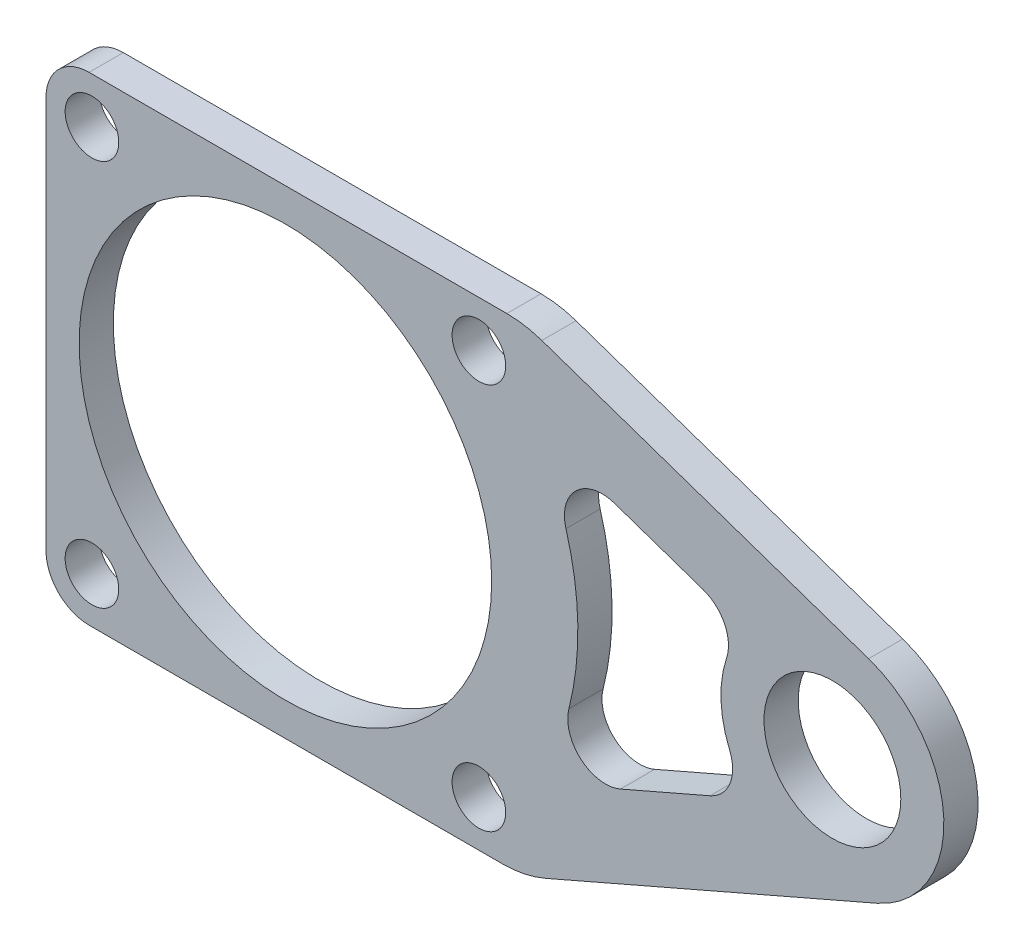
ISO-10303-21;
HEADER;
FILE_DESCRIPTION(('STEP AP214'),'2;1');
FILE_NAME('part.step','',(''),(''),'','','');
FILE_SCHEMA(('AUTOMOTIVE_DESIGN { 1 0 10303 214 1 1 1 1 }'));
ENDSEC;
DATA;
#1=APPLICATION_CONTEXT('core data for automotive mechanical design processes');
#2=APPLICATION_PROTOCOL_DEFINITION('international standard','automotive_design',2000,#1);
#3=PRODUCT_CONTEXT('',#1,'mechanical');
#4=PRODUCT('Part','Part','',(#3));
#5=PRODUCT_RELATED_PRODUCT_CATEGORY('part','',(#4));
#6=PRODUCT_DEFINITION_FORMATION('','',#4);
#7=PRODUCT_DEFINITION_CONTEXT('part definition',#1,'design');
#8=PRODUCT_DEFINITION('design','',#6,#7);
#9=PRODUCT_DEFINITION_SHAPE('','',#8);
#10=(LENGTH_UNIT() NAMED_UNIT(*) SI_UNIT(.MILLI.,.METRE.));
#11=(NAMED_UNIT(*) PLANE_ANGLE_UNIT() SI_UNIT($,.RADIAN.));
#12=(NAMED_UNIT(*) SI_UNIT($,.STERADIAN.) SOLID_ANGLE_UNIT());
#13=UNCERTAINTY_MEASURE_WITH_UNIT(LENGTH_MEASURE(1.E-05),#10,'distance_accuracy_value','');
#14=(GEOMETRIC_REPRESENTATION_CONTEXT(3) GLOBAL_UNCERTAINTY_ASSIGNED_CONTEXT((#13)) GLOBAL_UNIT_ASSIGNED_CONTEXT((#10,
#11,#12)) REPRESENTATION_CONTEXT('',''));
#15=CARTESIAN_POINT('',(0.,0.,0.));
#16=DIRECTION('',(0.,0.,1.));
#17=DIRECTION('',(1.,0.,0.));
#18=AXIS2_PLACEMENT_3D('',#15,#16,#17);
#19=CARTESIAN_POINT('',(50.7785111216399,1.477433,3.175));
#20=DIRECTION('',(0.,0.,1.));
#21=DIRECTION('',(1.,0.,0.));
#22=AXIS2_PLACEMENT_3D('',#19,#20,#21);
#23=PLANE('',#22);
#24=CARTESIAN_POINT('',(-17.9605122421383,17.9605122421383,3.175));
#25=DIRECTION('',(0.,0.,1.));
#26=DIRECTION('',(1.,0.,0.));
#27=AXIS2_PLACEMENT_3D('',#24,#25,#26);
#28=CIRCLE('',#27,2.4892);
#29=CARTESIAN_POINT('',(-15.4713122421383,17.9605122421383,3.175));
#30=VERTEX_POINT('',#29);
#31=EDGE_CURVE('E289',#30,#30,#28,.T.);
#32=ORIENTED_EDGE('',*,*,#31,.F.);
#33=EDGE_LOOP('',(#32));
#34=FACE_BOUND('',#33,.T.);
#35=CARTESIAN_POINT('',(17.9605122421383,17.9605122421383,3.175));
#36=DIRECTION('',(0.,0.,1.));
#37=DIRECTION('',(1.,0.,0.));
#38=AXIS2_PLACEMENT_3D('',#35,#36,#37);
#39=CIRCLE('',#38,2.4892);
#40=CARTESIAN_POINT('',(20.4497122421383,17.9605122421383,3.175));
#41=VERTEX_POINT('',#40);
#42=EDGE_CURVE('E304',#41,#41,#39,.T.);
#43=ORIENTED_EDGE('',*,*,#42,.F.);
#44=EDGE_LOOP('',(#43));
#45=FACE_BOUND('',#44,.T.);
#46=CARTESIAN_POINT('',(17.9605122421383,-17.9605122421383,3.175));
#47=DIRECTION('',(0.,0.,1.));
#48=DIRECTION('',(1.,0.,0.));
#49=AXIS2_PLACEMENT_3D('',#46,#47,#48);
#50=CIRCLE('',#49,2.4892);
#51=CARTESIAN_POINT('',(20.4497122421383,-17.9605122421383,3.175));
#52=VERTEX_POINT('',#51);
#53=EDGE_CURVE('E311',#52,#52,#50,.T.);
#54=ORIENTED_EDGE('',*,*,#53,.F.);
#55=EDGE_LOOP('',(#54));
#56=FACE_BOUND('',#55,.T.);
#57=CARTESIAN_POINT('',(-17.9605122421383,-17.9605122421383,3.175));
#58=DIRECTION('',(0.,0.,1.));
#59=DIRECTION('',(1.,0.,0.));
#60=AXIS2_PLACEMENT_3D('',#57,#58,#59);
#61=CIRCLE('',#60,2.4892);
#62=CARTESIAN_POINT('',(-15.4713122421383,-17.9605122421383,3.175));
#63=VERTEX_POINT('',#62);
#64=EDGE_CURVE('E320',#63,#63,#61,.T.);
#65=ORIENTED_EDGE('',*,*,#64,.F.);
#66=EDGE_LOOP('',(#65));
#67=FACE_BOUND('',#66,.T.);
#68=CARTESIAN_POINT('',(0.,0.,3.175));
#69=DIRECTION('',(0.,0.,1.));
#70=DIRECTION('',(1.,0.,0.));
#71=AXIS2_PLACEMENT_3D('',#68,#69,#70);
#72=CIRCLE('',#71,19.15);
#73=CARTESIAN_POINT('',(19.15,0.,3.175));
#74=VERTEX_POINT('',#73);
#75=EDGE_CURVE('E327',#74,#74,#72,.T.);
#76=ORIENTED_EDGE('',*,*,#75,.F.);
#77=EDGE_LOOP('',(#76));
#78=FACE_BOUND('',#77,.T.);
#79=DIRECTION('',(1.,0.,0.));
#80=VECTOR('',#79,1.);
#81=CARTESIAN_POINT('',(-22.225,-22.225,3.175));
#82=LINE('',#81,#80);
#83=CARTESIAN_POINT('',(-18.225,-22.225,3.175));
#84=VERTEX_POINT('',#83);
#85=CARTESIAN_POINT('',(20.1448698092587,-22.225,3.175));
#86=VERTEX_POINT('',#85);
#87=EDGE_CURVE('E338',#84,#86,#82,.T.);
#88=ORIENTED_EDGE('',*,*,#87,.T.);
#89=CARTESIAN_POINT('',(20.1448698092587,-12.225,3.175));
#90=DIRECTION('',(0.,0.,1.));
#91=DIRECTION('',(1.,0.,0.));
#92=AXIS2_PLACEMENT_3D('',#89,#90,#91);
#93=CIRCLE('',#92,10.);
#94=CARTESIAN_POINT('',(24.1325841208863,-21.3955035068332,3.175));
#95=VERTEX_POINT('',#94);
#96=EDGE_CURVE('E222',#86,#95,#93,.T.);
#97=ORIENTED_EDGE('',*,*,#96,.T.);
#98=DIRECTION('',(0.917050350683324,0.398771431162755,0.));
#99=VECTOR('',#98,1.);
#100=CARTESIAN_POINT('',(22.225,-22.225,3.175));
#101=LINE('',#100,#99);
#102=CARTESIAN_POINT('',(54.9057954341745,-8.0140381295724,3.175));
#103=VERTEX_POINT('',#102);
#104=EDGE_CURVE('E184',#95,#103,#101,.T.);
#105=ORIENTED_EDGE('',*,*,#104,.T.);
#106=CARTESIAN_POINT('',(50.7785111216399,1.477433,3.175));
#107=DIRECTION('',(0.,0.,1.));
#108=DIRECTION('',(1.,0.,0.));
#109=AXIS2_PLACEMENT_3D('',#106,#107,#108);
#110=CIRCLE('',#109,10.35);
#111=CARTESIAN_POINT('',(54.1397588848033,11.2664326156211,3.175));
#112=VERTEX_POINT('',#111);
#113=EDGE_CURVE('E177',#103,#112,#110,.T.);
#114=ORIENTED_EDGE('',*,*,#113,.T.);
#115=DIRECTION('',(-0.945797064311214,0.324758237986798,0.));
#116=VECTOR('',#115,1.);
#117=CARTESIAN_POINT('',(54.1397588848033,11.2664326156211,3.175));
#118=LINE('',#117,#116);
#119=CARTESIAN_POINT('',(23.8035581843681,21.6829706431121,3.175));
#120=VERTEX_POINT('',#119);
#121=EDGE_CURVE('E170',#112,#120,#118,.T.);
#122=ORIENTED_EDGE('',*,*,#121,.T.);
#123=CARTESIAN_POINT('',(20.5559758045002,12.225,3.175));
#124=DIRECTION('',(0.,0.,1.));
#125=DIRECTION('',(1.,0.,0.));
#126=AXIS2_PLACEMENT_3D('',#123,#124,#125);
#127=CIRCLE('',#126,10.);
#128=CARTESIAN_POINT('',(20.5559758045002,22.225,3.175));
#129=VERTEX_POINT('',#128);
#130=EDGE_CURVE('E218',#120,#129,#127,.T.);
#131=ORIENTED_EDGE('',*,*,#130,.T.);
#132=DIRECTION('',(-1.,0.,0.));
#133=VECTOR('',#132,1.);
#134=CARTESIAN_POINT('',(22.225,22.225,3.175));
#135=LINE('',#134,#133);
#136=CARTESIAN_POINT('',(-18.225,22.225,3.175));
#137=VERTEX_POINT('',#136);
#138=EDGE_CURVE('E178',#129,#137,#135,.T.);
#139=ORIENTED_EDGE('',*,*,#138,.T.);
#140=CARTESIAN_POINT('',(-18.225,18.225,3.175));
#141=DIRECTION('',(0.,0.,1.));
#142=DIRECTION('',(1.,0.,0.));
#143=AXIS2_PLACEMENT_3D('',#140,#141,#142);
#144=CIRCLE('',#143,4.);
#145=CARTESIAN_POINT('',(-22.225,18.225,3.175));
#146=VERTEX_POINT('',#145);
#147=EDGE_CURVE('E213',#137,#146,#144,.T.);
#148=ORIENTED_EDGE('',*,*,#147,.T.);
#149=DIRECTION('',(0.,-1.,0.));
#150=VECTOR('',#149,1.);
#151=CARTESIAN_POINT('',(-22.225,22.225,3.175));
#152=LINE('',#151,#150);
#153=CARTESIAN_POINT('',(-22.225,-18.225,3.175));
#154=VERTEX_POINT('',#153);
#155=EDGE_CURVE('E340',#146,#154,#152,.T.);
#156=ORIENTED_EDGE('',*,*,#155,.T.);
#157=CARTESIAN_POINT('',(-18.225,-18.225,3.175));
#158=DIRECTION('',(0.,0.,1.));
#159=DIRECTION('',(1.,0.,0.));
#160=AXIS2_PLACEMENT_3D('',#157,#158,#159);
#161=CIRCLE('',#160,4.);
#162=EDGE_CURVE('E216',#154,#84,#161,.T.);
#163=ORIENTED_EDGE('',*,*,#162,.T.);
#164=EDGE_LOOP('',(#88,#97,#105,#114,#122,#131,#139,#148,#156,#163));
#165=FACE_BOUND('',#164,.T.);
#166=CARTESIAN_POINT('',(50.7785111216399,1.477433,3.175));
#167=DIRECTION('',(0.,0.,1.));
#168=DIRECTION('',(1.,0.,0.));
#169=AXIS2_PLACEMENT_3D('',#166,#167,#168);
#170=CIRCLE('',#169,6.35);
#171=CARTESIAN_POINT('',(57.1285111216399,1.477433,3.175));
#172=VERTEX_POINT('',#171);
#173=EDGE_CURVE('E321',#172,#172,#170,.T.);
#174=ORIENTED_EDGE('',*,*,#173,.F.);
#175=EDGE_LOOP('',(#174));
#176=FACE_BOUND('',#175,.T.);
#177=DIRECTION('',(-0.945797064311214,0.324758237986798,0.));
#178=VECTOR('',#177,1.);
#179=CARTESIAN_POINT('',(6.89724520413109,20.0869246807743,3.175));
#180=LINE('',#179,#178);
#181=CARTESIAN_POINT('',(38.7679301474277,9.14349096103122,3.175));
#182=VERTEX_POINT('',#181);
#183=CARTESIAN_POINT('',(30.5380592538133,11.9693808597438,3.175));
#184=VERTEX_POINT('',#183);
#185=EDGE_CURVE('E267',#182,#184,#180,.T.);
#186=ORIENTED_EDGE('',*,*,#185,.F.);
#187=CARTESIAN_POINT('',(37.6312763144739,5.83320123594197,3.175));
#188=DIRECTION('',(0.,0.,1.));
#189=DIRECTION('',(1.,0.,0.));
#190=AXIS2_PLACEMENT_3D('',#187,#188,#189);
#191=CIRCLE('',#190,3.5);
#192=CARTESIAN_POINT('',(40.953682222422,4.73246558064978,3.175));
#193=VERTEX_POINT('',#192);
#194=EDGE_CURVE('E264',#182,#193,#191,.F.);
#195=ORIENTED_EDGE('',*,*,#194,.T.);
#196=CARTESIAN_POINT('',(50.7785111216399,1.477433,3.175));
#197=DIRECTION('',(0.,0.,1.));
#198=DIRECTION('',(1.,0.,0.));
#199=AXIS2_PLACEMENT_3D('',#196,#197,#198);
#200=CIRCLE('',#199,10.35);
#201=CARTESIAN_POINT('',(41.2428968337951,-2.54681353238958,3.175));
#202=VERTEX_POINT('',#201);
#203=EDGE_CURVE('E271',#193,#202,#200,.T.);
#204=ORIENTED_EDGE('',*,*,#203,.T.);
#205=CARTESIAN_POINT('',(38.0182929683403,-3.9076698476904,3.175));
#206=DIRECTION('',(0.,0.,1.));
#207=DIRECTION('',(1.,0.,0.));
#208=AXIS2_PLACEMENT_3D('',#205,#206,#207);
#209=CIRCLE('',#208,3.5);
#210=CARTESIAN_POINT('',(39.41399297741,-7.11734607508203,3.175));
#211=VERTEX_POINT('',#210);
#212=EDGE_CURVE('E254',#202,#211,#209,.F.);
#213=ORIENTED_EDGE('',*,*,#212,.T.);
#214=DIRECTION('',(0.917050350683324,0.398771431162755,0.));
#215=VECTOR('',#214,1.);
#216=CARTESIAN_POINT('',(8.87032718450018,-20.3989955637059,3.175));
#217=LINE('',#216,#215);
#218=CARTESIAN_POINT('',(31.1091243411402,-10.7286465333789,3.175));
#219=VERTEX_POINT('',#218);
#220=EDGE_CURVE('E300',#219,#211,#217,.T.);
#221=ORIENTED_EDGE('',*,*,#220,.F.);
#222=CARTESIAN_POINT('',(29.7134243320705,-7.51897030598726,3.175));
#223=DIRECTION('',(0.,0.,1.));
#224=DIRECTION('',(1.,0.,0.));
#225=AXIS2_PLACEMENT_3D('',#222,#223,#224);
#226=CIRCLE('',#225,3.5);
#227=CARTESIAN_POINT('',(26.3203742452109,-6.66036031998545,3.175));
#228=VERTEX_POINT('',#227);
#229=EDGE_CURVE('E260',#219,#228,#226,.F.);
#230=ORIENTED_EDGE('',*,*,#229,.T.);
#231=CARTESIAN_POINT('',(0.,0.,3.175));
#232=DIRECTION('',(0.,0.,1.));
#233=DIRECTION('',(1.,0.,0.));
#234=AXIS2_PLACEMENT_3D('',#231,#232,#233);
#235=CIRCLE('',#234,27.15);
#236=CARTESIAN_POINT('',(26.0439855522459,7.67028790557487,3.175));
#237=VERTEX_POINT('',#236);
#238=EDGE_CURVE('E269',#228,#237,#235,.T.);
#239=ORIENTED_EDGE('',*,*,#238,.T.);
#240=CARTESIAN_POINT('',(29.4014054208595,8.6590911346545,3.175));
#241=DIRECTION('',(0.,0.,1.));
#242=DIRECTION('',(1.,0.,0.));
#243=AXIS2_PLACEMENT_3D('',#240,#241,#242);
#244=CIRCLE('',#243,3.5);
#245=EDGE_CURVE('E47',#237,#184,#244,.F.);
#246=ORIENTED_EDGE('',*,*,#245,.T.);
#247=EDGE_LOOP('',(#186,#195,#204,#213,#221,#230,#239,#246));
#248=FACE_BOUND('',#247,.T.);
#249=ADVANCED_FACE('F41',(#34,#45,#56,#67,#78,#165,#176,#248),#23,.T.);
#250=CARTESIAN_POINT('',(50.7785111216399,1.477433,0.));
#251=DIRECTION('',(0.,0.,1.));
#252=DIRECTION('',(1.,0.,0.));
#253=AXIS2_PLACEMENT_3D('',#250,#251,#252);
#254=PLANE('',#253);
#255=CARTESIAN_POINT('',(50.7785111216399,1.477433,0.));
#256=DIRECTION('',(0.,0.,1.));
#257=DIRECTION('',(1.,0.,0.));
#258=AXIS2_PLACEMENT_3D('',#255,#256,#257);
#259=CIRCLE('',#258,6.35);
#260=CARTESIAN_POINT('',(57.1285111216399,1.477433,0.));
#261=VERTEX_POINT('',#260);
#262=EDGE_CURVE('E324',#261,#261,#259,.T.);
#263=ORIENTED_EDGE('',*,*,#262,.T.);
#264=EDGE_LOOP('',(#263));
#265=FACE_BOUND('',#264,.T.);
#266=CARTESIAN_POINT('',(0.,0.,0.));
#267=DIRECTION('',(0.,0.,1.));
#268=DIRECTION('',(1.,0.,0.));
#269=AXIS2_PLACEMENT_3D('',#266,#267,#268);
#270=CIRCLE('',#269,19.15);
#271=CARTESIAN_POINT('',(19.15,0.,0.));
#272=VERTEX_POINT('',#271);
#273=EDGE_CURVE('E326',#272,#272,#270,.T.);
#274=ORIENTED_EDGE('',*,*,#273,.T.);
#275=EDGE_LOOP('',(#274));
#276=FACE_BOUND('',#275,.T.);
#277=DIRECTION('',(0.917050350683324,0.398771431162755,0.));
#278=VECTOR('',#277,1.);
#279=CARTESIAN_POINT('',(22.225,-22.225,0.));
#280=LINE('',#279,#278);
#281=CARTESIAN_POINT('',(24.1325841208863,-21.3955035068332,0.));
#282=VERTEX_POINT('',#281);
#283=CARTESIAN_POINT('',(54.9057954341745,-8.0140381295724,0.));
#284=VERTEX_POINT('',#283);
#285=EDGE_CURVE('E186',#282,#284,#280,.T.);
#286=ORIENTED_EDGE('',*,*,#285,.F.);
#287=CARTESIAN_POINT('',(20.1448698092587,-12.225,0.));
#288=DIRECTION('',(0.,0.,1.));
#289=DIRECTION('',(1.,0.,0.));
#290=AXIS2_PLACEMENT_3D('',#287,#288,#289);
#291=CIRCLE('',#290,10.);
#292=CARTESIAN_POINT('',(20.1448698092587,-22.225,0.));
#293=VERTEX_POINT('',#292);
#294=EDGE_CURVE('E206',#282,#293,#291,.F.);
#295=ORIENTED_EDGE('',*,*,#294,.T.);
#296=DIRECTION('',(1.,0.,0.));
#297=VECTOR('',#296,1.);
#298=CARTESIAN_POINT('',(-22.225,-22.225,0.));
#299=LINE('',#298,#297);
#300=CARTESIAN_POINT('',(-18.225,-22.225,0.));
#301=VERTEX_POINT('',#300);
#302=EDGE_CURVE('E355',#301,#293,#299,.T.);
#303=ORIENTED_EDGE('',*,*,#302,.F.);
#304=CARTESIAN_POINT('',(-18.225,-18.225,0.));
#305=DIRECTION('',(0.,0.,1.));
#306=DIRECTION('',(1.,0.,0.));
#307=AXIS2_PLACEMENT_3D('',#304,#305,#306);
#308=CIRCLE('',#307,4.);
#309=CARTESIAN_POINT('',(-22.225,-18.225,0.));
#310=VERTEX_POINT('',#309);
#311=EDGE_CURVE('E201',#301,#310,#308,.F.);
#312=ORIENTED_EDGE('',*,*,#311,.T.);
#313=DIRECTION('',(0.,-1.,0.));
#314=VECTOR('',#313,1.);
#315=CARTESIAN_POINT('',(-22.225,22.225,0.));
#316=LINE('',#315,#314);
#317=CARTESIAN_POINT('',(-22.225,18.225,0.));
#318=VERTEX_POINT('',#317);
#319=EDGE_CURVE('E348',#318,#310,#316,.T.);
#320=ORIENTED_EDGE('',*,*,#319,.F.);
#321=CARTESIAN_POINT('',(-18.225,18.225,0.));
#322=DIRECTION('',(0.,0.,1.));
#323=DIRECTION('',(1.,0.,0.));
#324=AXIS2_PLACEMENT_3D('',#321,#322,#323);
#325=CIRCLE('',#324,4.);
#326=CARTESIAN_POINT('',(-18.225,22.225,0.));
#327=VERTEX_POINT('',#326);
#328=EDGE_CURVE('E200',#318,#327,#325,.F.);
#329=ORIENTED_EDGE('',*,*,#328,.T.);
#330=DIRECTION('',(-1.,0.,0.));
#331=VECTOR('',#330,1.);
#332=CARTESIAN_POINT('',(22.225,22.225,0.));
#333=LINE('',#332,#331);
#334=CARTESIAN_POINT('',(20.5559758045002,22.225,0.));
#335=VERTEX_POINT('',#334);
#336=EDGE_CURVE('E349',#335,#327,#333,.T.);
#337=ORIENTED_EDGE('',*,*,#336,.F.);
#338=CARTESIAN_POINT('',(20.5559758045002,12.225,0.));
#339=DIRECTION('',(0.,0.,1.));
#340=DIRECTION('',(1.,0.,0.));
#341=AXIS2_PLACEMENT_3D('',#338,#339,#340);
#342=CIRCLE('',#341,10.);
#343=CARTESIAN_POINT('',(23.8035581843681,21.6829706431121,0.));
#344=VERTEX_POINT('',#343);
#345=EDGE_CURVE('E207',#335,#344,#342,.F.);
#346=ORIENTED_EDGE('',*,*,#345,.T.);
#347=DIRECTION('',(-0.945797064311214,0.324758237986798,0.));
#348=VECTOR('',#347,1.);
#349=CARTESIAN_POINT('',(54.1397588848033,11.2664326156211,0.));
#350=LINE('',#349,#348);
#351=CARTESIAN_POINT('',(54.1397588848033,11.2664326156211,0.));
#352=VERTEX_POINT('',#351);
#353=EDGE_CURVE('E341',#352,#344,#350,.T.);
#354=ORIENTED_EDGE('',*,*,#353,.F.);
#355=CARTESIAN_POINT('',(50.7785111216399,1.477433,0.));
#356=DIRECTION('',(0.,0.,1.));
#357=DIRECTION('',(1.,0.,0.));
#358=AXIS2_PLACEMENT_3D('',#355,#356,#357);
#359=CIRCLE('',#358,10.35);
#360=EDGE_CURVE('E194',#284,#352,#359,.T.);
#361=ORIENTED_EDGE('',*,*,#360,.F.);
#362=EDGE_LOOP('',(#286,#295,#303,#312,#320,#329,#337,#346,#354,#361));
#363=FACE_BOUND('',#362,.T.);
#364=CARTESIAN_POINT('',(-17.9605122421383,-17.9605122421383,0.));
#365=DIRECTION('',(0.,0.,1.));
#366=DIRECTION('',(1.,0.,0.));
#367=AXIS2_PLACEMENT_3D('',#364,#365,#366);
#368=CIRCLE('',#367,2.4892);
#369=CARTESIAN_POINT('',(-15.4713122421383,-17.9605122421383,0.));
#370=VERTEX_POINT('',#369);
#371=EDGE_CURVE('E318',#370,#370,#368,.T.);
#372=ORIENTED_EDGE('',*,*,#371,.T.);
#373=EDGE_LOOP('',(#372));
#374=FACE_BOUND('',#373,.T.);
#375=CARTESIAN_POINT('',(17.9605122421383,-17.9605122421383,0.));
#376=DIRECTION('',(0.,0.,1.));
#377=DIRECTION('',(1.,0.,0.));
#378=AXIS2_PLACEMENT_3D('',#375,#376,#377);
#379=CIRCLE('',#378,2.4892);
#380=CARTESIAN_POINT('',(20.4497122421383,-17.9605122421383,0.));
#381=VERTEX_POINT('',#380);
#382=EDGE_CURVE('E313',#381,#381,#379,.T.);
#383=ORIENTED_EDGE('',*,*,#382,.T.);
#384=EDGE_LOOP('',(#383));
#385=FACE_BOUND('',#384,.T.);
#386=CARTESIAN_POINT('',(17.9605122421383,17.9605122421383,0.));
#387=DIRECTION('',(0.,0.,1.));
#388=DIRECTION('',(1.,0.,0.));
#389=AXIS2_PLACEMENT_3D('',#386,#387,#388);
#390=CIRCLE('',#389,2.4892);
#391=CARTESIAN_POINT('',(20.4497122421383,17.9605122421383,0.));
#392=VERTEX_POINT('',#391);
#393=EDGE_CURVE('E308',#392,#392,#390,.T.);
#394=ORIENTED_EDGE('',*,*,#393,.T.);
#395=EDGE_LOOP('',(#394));
#396=FACE_BOUND('',#395,.T.);
#397=CARTESIAN_POINT('',(-17.9605122421383,17.9605122421383,0.));
#398=DIRECTION('',(0.,0.,1.));
#399=DIRECTION('',(1.,0.,0.));
#400=AXIS2_PLACEMENT_3D('',#397,#398,#399);
#401=CIRCLE('',#400,2.4892);
#402=CARTESIAN_POINT('',(-15.4713122421383,17.9605122421383,0.));
#403=VERTEX_POINT('',#402);
#404=EDGE_CURVE('E305',#403,#403,#401,.T.);
#405=ORIENTED_EDGE('',*,*,#404,.T.);
#406=EDGE_LOOP('',(#405));
#407=FACE_BOUND('',#406,.T.);
#408=CARTESIAN_POINT('',(50.7785111216399,1.477433,0.));
#409=DIRECTION('',(0.,0.,1.));
#410=DIRECTION('',(1.,0.,0.));
#411=AXIS2_PLACEMENT_3D('',#408,#409,#410);
#412=CIRCLE('',#411,10.35);
#413=CARTESIAN_POINT('',(40.953682222422,4.73246558064978,0.));
#414=VERTEX_POINT('',#413);
#415=CARTESIAN_POINT('',(41.2428968337951,-2.54681353238958,0.));
#416=VERTEX_POINT('',#415);
#417=EDGE_CURVE('E288',#414,#416,#412,.T.);
#418=ORIENTED_EDGE('',*,*,#417,.F.);
#419=CARTESIAN_POINT('',(37.6312763144739,5.83320123594197,0.));
#420=DIRECTION('',(0.,0.,1.));
#421=DIRECTION('',(1.,0.,0.));
#422=AXIS2_PLACEMENT_3D('',#419,#420,#421);
#423=CIRCLE('',#422,3.5);
#424=CARTESIAN_POINT('',(38.7679301474277,9.14349096103122,0.));
#425=VERTEX_POINT('',#424);
#426=EDGE_CURVE('E64',#414,#425,#423,.T.);
#427=ORIENTED_EDGE('',*,*,#426,.T.);
#428=DIRECTION('',(-0.945797064311214,0.324758237986798,0.));
#429=VECTOR('',#428,1.);
#430=CARTESIAN_POINT('',(6.89724520413109,20.0869246807743,0.));
#431=LINE('',#430,#429);
#432=CARTESIAN_POINT('',(30.5380592538133,11.9693808597438,0.));
#433=VERTEX_POINT('',#432);
#434=EDGE_CURVE('E284',#425,#433,#431,.T.);
#435=ORIENTED_EDGE('',*,*,#434,.T.);
#436=CARTESIAN_POINT('',(29.4014054208595,8.6590911346545,0.));
#437=DIRECTION('',(0.,0.,1.));
#438=DIRECTION('',(1.,0.,0.));
#439=AXIS2_PLACEMENT_3D('',#436,#437,#438);
#440=CIRCLE('',#439,3.5);
#441=CARTESIAN_POINT('',(26.0439855522459,7.67028790557487,0.));
#442=VERTEX_POINT('',#441);
#443=EDGE_CURVE('E12',#433,#442,#440,.T.);
#444=ORIENTED_EDGE('',*,*,#443,.T.);
#445=CARTESIAN_POINT('',(0.,0.,0.));
#446=DIRECTION('',(0.,0.,1.));
#447=DIRECTION('',(1.,0.,0.));
#448=AXIS2_PLACEMENT_3D('',#445,#446,#447);
#449=CIRCLE('',#448,27.15);
#450=CARTESIAN_POINT('',(26.3203742452109,-6.66036031998545,0.));
#451=VERTEX_POINT('',#450);
#452=EDGE_CURVE('E276',#451,#442,#449,.T.);
#453=ORIENTED_EDGE('',*,*,#452,.F.);
#454=CARTESIAN_POINT('',(29.7134243320705,-7.51897030598726,0.));
#455=DIRECTION('',(0.,0.,1.));
#456=DIRECTION('',(1.,0.,0.));
#457=AXIS2_PLACEMENT_3D('',#454,#455,#456);
#458=CIRCLE('',#457,3.5);
#459=CARTESIAN_POINT('',(31.1091243411402,-10.7286465333789,0.));
#460=VERTEX_POINT('',#459);
#461=EDGE_CURVE('E256',#451,#460,#458,.T.);
#462=ORIENTED_EDGE('',*,*,#461,.T.);
#463=DIRECTION('',(0.917050350683324,0.398771431162755,0.));
#464=VECTOR('',#463,1.);
#465=CARTESIAN_POINT('',(8.87032718450018,-20.3989955637059,0.));
#466=LINE('',#465,#464);
#467=CARTESIAN_POINT('',(39.41399297741,-7.11734607508203,0.));
#468=VERTEX_POINT('',#467);
#469=EDGE_CURVE('E282',#460,#468,#466,.T.);
#470=ORIENTED_EDGE('',*,*,#469,.T.);
#471=CARTESIAN_POINT('',(38.0182929683403,-3.9076698476904,0.));
#472=DIRECTION('',(0.,0.,1.));
#473=DIRECTION('',(1.,0.,0.));
#474=AXIS2_PLACEMENT_3D('',#471,#472,#473);
#475=CIRCLE('',#474,3.5);
#476=EDGE_CURVE('E253',#468,#416,#475,.T.);
#477=ORIENTED_EDGE('',*,*,#476,.T.);
#478=EDGE_LOOP('',(#418,#427,#435,#444,#453,#462,#470,#477));
#479=FACE_BOUND('',#478,.T.);
#480=ADVANCED_FACE('F279',(#265,#276,#363,#374,#385,#396,#407,#479),#254,.F.);
#481=CARTESIAN_POINT('',(50.7785111216399,1.477433,3.175));
#482=DIRECTION('',(0.,0.,-1.));
#483=DIRECTION('',(-1.,0.,0.));
#484=AXIS2_PLACEMENT_3D('',#481,#482,#483);
#485=CYLINDRICAL_SURFACE('',#484,10.35);
#486=ORIENTED_EDGE('',*,*,#360,.T.);
#487=DIRECTION('',(0.,0.,-1.));
#488=VECTOR('',#487,1.);
#489=CARTESIAN_POINT('',(54.1397588848033,11.2664326156211,3.175));
#490=LINE('',#489,#488);
#491=EDGE_CURVE('E175',#112,#352,#490,.T.);
#492=ORIENTED_EDGE('',*,*,#491,.F.);
#493=ORIENTED_EDGE('',*,*,#113,.F.);
#494=DIRECTION('',(0.,0.,-1.));
#495=VECTOR('',#494,1.);
#496=CARTESIAN_POINT('',(54.9057954341745,-8.0140381295724,3.175));
#497=LINE('',#496,#495);
#498=EDGE_CURVE('E193',#103,#284,#497,.T.);
#499=ORIENTED_EDGE('',*,*,#498,.T.);
#500=EDGE_LOOP('',(#486,#492,#493,#499));
#501=FACE_BOUND('',#500,.T.);
#502=ADVANCED_FACE('F192',(#501),#485,.T.);
#503=CARTESIAN_POINT('',(54.1397588848033,11.2664326156211,3.175));
#504=DIRECTION('',(-0.324758237986798,-0.945797064311214,0.));
#505=DIRECTION('',(0.945797064311214,-0.324758237986798,0.));
#506=AXIS2_PLACEMENT_3D('',#503,#504,#505);
#507=PLANE('',#506);
#508=ORIENTED_EDGE('',*,*,#353,.T.);
#509=DIRECTION('',(0.,0.,-1.));
#510=VECTOR('',#509,1.);
#511=CARTESIAN_POINT('',(23.8035581843681,21.6829706431121,3.175));
#512=LINE('',#511,#510);
#513=EDGE_CURVE('E174',#344,#120,#512,.F.);
#514=ORIENTED_EDGE('',*,*,#513,.T.);
#515=ORIENTED_EDGE('',*,*,#121,.F.);
#516=ORIENTED_EDGE('',*,*,#491,.T.);
#517=EDGE_LOOP('',(#508,#514,#515,#516));
#518=FACE_BOUND('',#517,.T.);
#519=ADVANCED_FACE('F167',(#518),#507,.F.);
#520=CARTESIAN_POINT('',(22.225,22.225,3.175));
#521=DIRECTION('',(0.,-1.,0.));
#522=DIRECTION('',(1.,0.,0.));
#523=AXIS2_PLACEMENT_3D('',#520,#521,#522);
#524=PLANE('',#523);
#525=ORIENTED_EDGE('',*,*,#138,.F.);
#526=DIRECTION('',(0.,0.,-1.));
#527=VECTOR('',#526,1.);
#528=CARTESIAN_POINT('',(20.5559758045002,22.225,3.175));
#529=LINE('',#528,#527);
#530=EDGE_CURVE('E223',#129,#335,#529,.T.);
#531=ORIENTED_EDGE('',*,*,#530,.T.);
#532=ORIENTED_EDGE('',*,*,#336,.T.);
#533=DIRECTION('',(0.,0.,-1.));
#534=VECTOR('',#533,1.);
#535=CARTESIAN_POINT('',(-18.225,22.225,3.175));
#536=LINE('',#535,#534);
#537=EDGE_CURVE('E224',#327,#137,#536,.F.);
#538=ORIENTED_EDGE('',*,*,#537,.T.);
#539=EDGE_LOOP('',(#525,#531,#532,#538));
#540=FACE_BOUND('',#539,.T.);
#541=ADVANCED_FACE('F370',(#540),#524,.F.);
#542=CARTESIAN_POINT('',(-22.225,22.225,3.175));
#543=DIRECTION('',(1.,0.,0.));
#544=DIRECTION('',(0.,0.,-1.));
#545=AXIS2_PLACEMENT_3D('',#542,#543,#544);
#546=PLANE('',#545);
#547=ORIENTED_EDGE('',*,*,#319,.T.);
#548=DIRECTION('',(0.,0.,-1.));
#549=VECTOR('',#548,1.);
#550=CARTESIAN_POINT('',(-22.225,-18.225,3.175));
#551=LINE('',#550,#549);
#552=EDGE_CURVE('E235',#310,#154,#551,.F.);
#553=ORIENTED_EDGE('',*,*,#552,.T.);
#554=ORIENTED_EDGE('',*,*,#155,.F.);
#555=DIRECTION('',(0.,0.,-1.));
#556=VECTOR('',#555,1.);
#557=CARTESIAN_POINT('',(-22.225,18.225,3.175));
#558=LINE('',#557,#556);
#559=EDGE_CURVE('E230',#146,#318,#558,.T.);
#560=ORIENTED_EDGE('',*,*,#559,.T.);
#561=EDGE_LOOP('',(#547,#553,#554,#560));
#562=FACE_BOUND('',#561,.T.);
#563=ADVANCED_FACE('F374',(#562),#546,.F.);
#564=CARTESIAN_POINT('',(-22.225,-22.225,3.175));
#565=DIRECTION('',(0.,1.,0.));
#566=DIRECTION('',(0.,0.,1.));
#567=AXIS2_PLACEMENT_3D('',#564,#565,#566);
#568=PLANE('',#567);
#569=ORIENTED_EDGE('',*,*,#302,.T.);
#570=DIRECTION('',(0.,0.,-1.));
#571=VECTOR('',#570,1.);
#572=CARTESIAN_POINT('',(20.1448698092587,-22.225,3.175));
#573=LINE('',#572,#571);
#574=EDGE_CURVE('E214',#293,#86,#573,.F.);
#575=ORIENTED_EDGE('',*,*,#574,.T.);
#576=ORIENTED_EDGE('',*,*,#87,.F.);
#577=DIRECTION('',(0.,0.,-1.));
#578=VECTOR('',#577,1.);
#579=CARTESIAN_POINT('',(-18.225,-22.225,3.175));
#580=LINE('',#579,#578);
#581=EDGE_CURVE('E208',#84,#301,#580,.T.);
#582=ORIENTED_EDGE('',*,*,#581,.T.);
#583=EDGE_LOOP('',(#569,#575,#576,#582));
#584=FACE_BOUND('',#583,.T.);
#585=ADVANCED_FACE('F381',(#584),#568,.F.);
#586=CARTESIAN_POINT('',(22.225,-22.225,3.175));
#587=DIRECTION('',(-0.398771431162755,0.917050350683324,0.));
#588=DIRECTION('',(-0.917050350683324,-0.398771431162755,0.));
#589=AXIS2_PLACEMENT_3D('',#586,#587,#588);
#590=PLANE('',#589);
#591=ORIENTED_EDGE('',*,*,#104,.F.);
#592=DIRECTION('',(0.,0.,-1.));
#593=VECTOR('',#592,1.);
#594=CARTESIAN_POINT('',(24.1325841208863,-21.3955035068332,3.175));
#595=LINE('',#594,#593);
#596=EDGE_CURVE('E191',#95,#282,#595,.T.);
#597=ORIENTED_EDGE('',*,*,#596,.T.);
#598=ORIENTED_EDGE('',*,*,#285,.T.);
#599=ORIENTED_EDGE('',*,*,#498,.F.);
#600=EDGE_LOOP('',(#591,#597,#598,#599));
#601=FACE_BOUND('',#600,.T.);
#602=ADVANCED_FACE('F358',(#601),#590,.F.);
#603=CARTESIAN_POINT('',(0.,0.,3.175));
#604=DIRECTION('',(0.,0.,-1.));
#605=DIRECTION('',(-1.,0.,0.));
#606=AXIS2_PLACEMENT_3D('',#603,#604,#605);
#607=CYLINDRICAL_SURFACE('',#606,19.15);
#608=ORIENTED_EDGE('',*,*,#75,.T.);
#609=EDGE_LOOP('',(#608));
#610=FACE_BOUND('',#609,.T.);
#611=ORIENTED_EDGE('',*,*,#273,.F.);
#612=EDGE_LOOP('',(#611));
#613=FACE_BOUND('',#612,.T.);
#614=ADVANCED_FACE('F413',(#610,#613),#607,.F.);
#615=CARTESIAN_POINT('',(50.7785111216399,1.477433,3.175));
#616=DIRECTION('',(0.,0.,-1.));
#617=DIRECTION('',(-1.,0.,0.));
#618=AXIS2_PLACEMENT_3D('',#615,#616,#617);
#619=CYLINDRICAL_SURFACE('',#618,6.35);
#620=ORIENTED_EDGE('',*,*,#173,.T.);
#621=EDGE_LOOP('',(#620));
#622=FACE_BOUND('',#621,.T.);
#623=ORIENTED_EDGE('',*,*,#262,.F.);
#624=EDGE_LOOP('',(#623));
#625=FACE_BOUND('',#624,.T.);
#626=ADVANCED_FACE('F436',(#622,#625),#619,.F.);
#627=CARTESIAN_POINT('',(-17.9605122421383,-17.9605122421383,3.175));
#628=DIRECTION('',(0.,0.,1.));
#629=DIRECTION('',(1.,0.,0.));
#630=AXIS2_PLACEMENT_3D('',#627,#628,#629);
#631=CYLINDRICAL_SURFACE('',#630,2.4892);
#632=ORIENTED_EDGE('',*,*,#371,.F.);
#633=EDGE_LOOP('',(#632));
#634=FACE_BOUND('',#633,.T.);
#635=ORIENTED_EDGE('',*,*,#64,.T.);
#636=EDGE_LOOP('',(#635));
#637=FACE_BOUND('',#636,.T.);
#638=ADVANCED_FACE('F444',(#634,#637),#631,.F.);
#639=CARTESIAN_POINT('',(17.9605122421383,-17.9605122421383,3.175));
#640=DIRECTION('',(0.,0.,1.));
#641=DIRECTION('',(1.,0.,0.));
#642=AXIS2_PLACEMENT_3D('',#639,#640,#641);
#643=CYLINDRICAL_SURFACE('',#642,2.4892);
#644=ORIENTED_EDGE('',*,*,#382,.F.);
#645=EDGE_LOOP('',(#644));
#646=FACE_BOUND('',#645,.T.);
#647=ORIENTED_EDGE('',*,*,#53,.T.);
#648=EDGE_LOOP('',(#647));
#649=FACE_BOUND('',#648,.T.);
#650=ADVANCED_FACE('F454',(#646,#649),#643,.F.);
#651=CARTESIAN_POINT('',(17.9605122421383,17.9605122421383,3.175));
#652=DIRECTION('',(0.,0.,1.));
#653=DIRECTION('',(1.,0.,0.));
#654=AXIS2_PLACEMENT_3D('',#651,#652,#653);
#655=CYLINDRICAL_SURFACE('',#654,2.4892);
#656=ORIENTED_EDGE('',*,*,#393,.F.);
#657=EDGE_LOOP('',(#656));
#658=FACE_BOUND('',#657,.T.);
#659=ORIENTED_EDGE('',*,*,#42,.T.);
#660=EDGE_LOOP('',(#659));
#661=FACE_BOUND('',#660,.T.);
#662=ADVANCED_FACE('F399',(#658,#661),#655,.F.);
#663=CARTESIAN_POINT('',(-17.9605122421383,17.9605122421383,3.175));
#664=DIRECTION('',(0.,0.,1.));
#665=DIRECTION('',(1.,0.,0.));
#666=AXIS2_PLACEMENT_3D('',#663,#664,#665);
#667=CYLINDRICAL_SURFACE('',#666,2.4892);
#668=ORIENTED_EDGE('',*,*,#404,.F.);
#669=EDGE_LOOP('',(#668));
#670=FACE_BOUND('',#669,.T.);
#671=ORIENTED_EDGE('',*,*,#31,.T.);
#672=EDGE_LOOP('',(#671));
#673=FACE_BOUND('',#672,.T.);
#674=ADVANCED_FACE('F388',(#670,#673),#667,.F.);
#675=CARTESIAN_POINT('',(20.1448698092587,-12.225,3.175));
#676=DIRECTION('',(0.,0.,-1.));
#677=DIRECTION('',(-1.,0.,0.));
#678=AXIS2_PLACEMENT_3D('',#675,#676,#677);
#679=CYLINDRICAL_SURFACE('',#678,10.);
#680=ORIENTED_EDGE('',*,*,#96,.F.);
#681=ORIENTED_EDGE('',*,*,#574,.F.);
#682=ORIENTED_EDGE('',*,*,#294,.F.);
#683=ORIENTED_EDGE('',*,*,#596,.F.);
#684=EDGE_LOOP('',(#680,#681,#682,#683));
#685=FACE_BOUND('',#684,.T.);
#686=ADVANCED_FACE('F389',(#685),#679,.T.);
#687=CARTESIAN_POINT('',(20.5559758045002,12.225,3.175));
#688=DIRECTION('',(0.,0.,-1.));
#689=DIRECTION('',(-1.,0.,0.));
#690=AXIS2_PLACEMENT_3D('',#687,#688,#689);
#691=CYLINDRICAL_SURFACE('',#690,10.);
#692=ORIENTED_EDGE('',*,*,#130,.F.);
#693=ORIENTED_EDGE('',*,*,#513,.F.);
#694=ORIENTED_EDGE('',*,*,#345,.F.);
#695=ORIENTED_EDGE('',*,*,#530,.F.);
#696=EDGE_LOOP('',(#692,#693,#694,#695));
#697=FACE_BOUND('',#696,.T.);
#698=ADVANCED_FACE('F365',(#697),#691,.T.);
#699=CARTESIAN_POINT('',(-18.225,-18.225,3.175));
#700=DIRECTION('',(0.,0.,-1.));
#701=DIRECTION('',(-1.,0.,0.));
#702=AXIS2_PLACEMENT_3D('',#699,#700,#701);
#703=CYLINDRICAL_SURFACE('',#702,4.);
#704=ORIENTED_EDGE('',*,*,#162,.F.);
#705=ORIENTED_EDGE('',*,*,#552,.F.);
#706=ORIENTED_EDGE('',*,*,#311,.F.);
#707=ORIENTED_EDGE('',*,*,#581,.F.);
#708=EDGE_LOOP('',(#704,#705,#706,#707));
#709=FACE_BOUND('',#708,.T.);
#710=ADVANCED_FACE('F378',(#709),#703,.T.);
#711=CARTESIAN_POINT('',(-18.225,18.225,3.175));
#712=DIRECTION('',(0.,0.,-1.));
#713=DIRECTION('',(-1.,0.,0.));
#714=AXIS2_PLACEMENT_3D('',#711,#712,#713);
#715=CYLINDRICAL_SURFACE('',#714,4.);
#716=ORIENTED_EDGE('',*,*,#147,.F.);
#717=ORIENTED_EDGE('',*,*,#537,.F.);
#718=ORIENTED_EDGE('',*,*,#328,.F.);
#719=ORIENTED_EDGE('',*,*,#559,.F.);
#720=EDGE_LOOP('',(#716,#717,#718,#719));
#721=FACE_BOUND('',#720,.T.);
#722=ADVANCED_FACE('F369',(#721),#715,.T.);
#723=CARTESIAN_POINT('',(50.7785111216399,1.477433,0.));
#724=DIRECTION('',(0.,0.,1.));
#725=DIRECTION('',(1.,0.,0.));
#726=AXIS2_PLACEMENT_3D('',#723,#724,#725);
#727=CYLINDRICAL_SURFACE('',#726,10.35);
#728=ORIENTED_EDGE('',*,*,#417,.T.);
#729=DIRECTION('',(0.,0.,1.));
#730=VECTOR('',#729,1.);
#731=CARTESIAN_POINT('',(41.2428968337951,-2.54681353238958,0.));
#732=LINE('',#731,#730);
#733=EDGE_CURVE('E236',#416,#202,#732,.T.);
#734=ORIENTED_EDGE('',*,*,#733,.T.);
#735=ORIENTED_EDGE('',*,*,#203,.F.);
#736=DIRECTION('',(0.,0.,1.));
#737=VECTOR('',#736,1.);
#738=CARTESIAN_POINT('',(40.953682222422,4.73246558064978,0.));
#739=LINE('',#738,#737);
#740=EDGE_CURVE('E234',#193,#414,#739,.F.);
#741=ORIENTED_EDGE('',*,*,#740,.T.);
#742=EDGE_LOOP('',(#728,#734,#735,#741));
#743=FACE_BOUND('',#742,.T.);
#744=ADVANCED_FACE('F528',(#743),#727,.T.);
#745=CARTESIAN_POINT('',(8.87032718450018,-20.3989955637059,0.));
#746=DIRECTION('',(0.398771431162755,-0.917050350683324,0.));
#747=DIRECTION('',(0.917050350683324,0.398771431162755,0.));
#748=AXIS2_PLACEMENT_3D('',#745,#746,#747);
#749=PLANE('',#748);
#750=ORIENTED_EDGE('',*,*,#220,.T.);
#751=DIRECTION('',(0.,0.,1.));
#752=VECTOR('',#751,1.);
#753=CARTESIAN_POINT('',(39.41399297741,-7.11734607508203,0.));
#754=LINE('',#753,#752);
#755=EDGE_CURVE('E245',#211,#468,#754,.F.);
#756=ORIENTED_EDGE('',*,*,#755,.T.);
#757=ORIENTED_EDGE('',*,*,#469,.F.);
#758=DIRECTION('',(0.,0.,1.));
#759=VECTOR('',#758,1.);
#760=CARTESIAN_POINT('',(31.1091243411402,-10.7286465333789,0.));
#761=LINE('',#760,#759);
#762=EDGE_CURVE('E237',#460,#219,#761,.T.);
#763=ORIENTED_EDGE('',*,*,#762,.T.);
#764=EDGE_LOOP('',(#750,#756,#757,#763));
#765=FACE_BOUND('',#764,.T.);
#766=ADVANCED_FACE('F549',(#765),#749,.F.);
#767=CARTESIAN_POINT('',(0.,0.,0.));
#768=DIRECTION('',(0.,0.,1.));
#769=DIRECTION('',(1.,0.,0.));
#770=AXIS2_PLACEMENT_3D('',#767,#768,#769);
#771=CYLINDRICAL_SURFACE('',#770,27.15);
#772=ORIENTED_EDGE('',*,*,#238,.F.);
#773=DIRECTION('',(0.,0.,1.));
#774=VECTOR('',#773,1.);
#775=CARTESIAN_POINT('',(26.3203742452109,-6.66036031998545,0.));
#776=LINE('',#775,#774);
#777=EDGE_CURVE('E250',#228,#451,#776,.F.);
#778=ORIENTED_EDGE('',*,*,#777,.T.);
#779=ORIENTED_EDGE('',*,*,#452,.T.);
#780=DIRECTION('',(0.,0.,1.));
#781=VECTOR('',#780,1.);
#782=CARTESIAN_POINT('',(26.0439855522459,7.67028790557487,0.));
#783=LINE('',#782,#781);
#784=EDGE_CURVE('E242',#442,#237,#783,.T.);
#785=ORIENTED_EDGE('',*,*,#784,.T.);
#786=EDGE_LOOP('',(#772,#778,#779,#785));
#787=FACE_BOUND('',#786,.T.);
#788=ADVANCED_FACE('F285',(#787),#771,.T.);
#789=CARTESIAN_POINT('',(6.89724520413109,20.0869246807743,0.));
#790=DIRECTION('',(0.324758237986798,0.945797064311214,0.));
#791=DIRECTION('',(-0.945797064311214,0.324758237986798,0.));
#792=AXIS2_PLACEMENT_3D('',#789,#790,#791);
#793=PLANE('',#792);
#794=ORIENTED_EDGE('',*,*,#434,.F.);
#795=DIRECTION('',(0.,0.,1.));
#796=VECTOR('',#795,1.);
#797=CARTESIAN_POINT('',(38.7679301474277,9.14349096103122,0.));
#798=LINE('',#797,#796);
#799=EDGE_CURVE('E249',#425,#182,#798,.T.);
#800=ORIENTED_EDGE('',*,*,#799,.T.);
#801=ORIENTED_EDGE('',*,*,#185,.T.);
#802=DIRECTION('',(0.,0.,1.));
#803=VECTOR('',#802,1.);
#804=CARTESIAN_POINT('',(30.5380592538133,11.9693808597438,0.));
#805=LINE('',#804,#803);
#806=EDGE_CURVE('E57',#184,#433,#805,.F.);
#807=ORIENTED_EDGE('',*,*,#806,.T.);
#808=EDGE_LOOP('',(#794,#800,#801,#807));
#809=FACE_BOUND('',#808,.T.);
#810=ADVANCED_FACE('F272',(#809),#793,.F.);
#811=CARTESIAN_POINT('',(38.0182929683403,-3.9076698476904,0.));
#812=DIRECTION('',(0.,0.,1.));
#813=DIRECTION('',(1.,0.,0.));
#814=AXIS2_PLACEMENT_3D('',#811,#812,#813);
#815=CYLINDRICAL_SURFACE('',#814,3.5);
#816=ORIENTED_EDGE('',*,*,#476,.F.);
#817=ORIENTED_EDGE('',*,*,#755,.F.);
#818=ORIENTED_EDGE('',*,*,#212,.F.);
#819=ORIENTED_EDGE('',*,*,#733,.F.);
#820=EDGE_LOOP('',(#816,#817,#818,#819));
#821=FACE_BOUND('',#820,.T.);
#822=ADVANCED_FACE('F575',(#821),#815,.F.);
#823=CARTESIAN_POINT('',(29.7134243320705,-7.51897030598726,0.));
#824=DIRECTION('',(0.,0.,1.));
#825=DIRECTION('',(1.,0.,0.));
#826=AXIS2_PLACEMENT_3D('',#823,#824,#825);
#827=CYLINDRICAL_SURFACE('',#826,3.5);
#828=ORIENTED_EDGE('',*,*,#461,.F.);
#829=ORIENTED_EDGE('',*,*,#777,.F.);
#830=ORIENTED_EDGE('',*,*,#229,.F.);
#831=ORIENTED_EDGE('',*,*,#762,.F.);
#832=EDGE_LOOP('',(#828,#829,#830,#831));
#833=FACE_BOUND('',#832,.T.);
#834=ADVANCED_FACE('F578',(#833),#827,.F.);
#835=CARTESIAN_POINT('',(37.6312763144739,5.83320123594197,0.));
#836=DIRECTION('',(0.,0.,1.));
#837=DIRECTION('',(1.,0.,0.));
#838=AXIS2_PLACEMENT_3D('',#835,#836,#837);
#839=CYLINDRICAL_SURFACE('',#838,3.5);
#840=ORIENTED_EDGE('',*,*,#426,.F.);
#841=ORIENTED_EDGE('',*,*,#740,.F.);
#842=ORIENTED_EDGE('',*,*,#194,.F.);
#843=ORIENTED_EDGE('',*,*,#799,.F.);
#844=EDGE_LOOP('',(#840,#841,#842,#843));
#845=FACE_BOUND('',#844,.T.);
#846=ADVANCED_FACE('F588',(#845),#839,.F.);
#847=CARTESIAN_POINT('',(29.4014054208595,8.6590911346545,0.));
#848=DIRECTION('',(0.,0.,1.));
#849=DIRECTION('',(1.,0.,0.));
#850=AXIS2_PLACEMENT_3D('',#847,#848,#849);
#851=CYLINDRICAL_SURFACE('',#850,3.5);
#852=ORIENTED_EDGE('',*,*,#443,.F.);
#853=ORIENTED_EDGE('',*,*,#806,.F.);
#854=ORIENTED_EDGE('',*,*,#245,.F.);
#855=ORIENTED_EDGE('',*,*,#784,.F.);
#856=EDGE_LOOP('',(#852,#853,#854,#855));
#857=FACE_BOUND('',#856,.T.);
#858=ADVANCED_FACE('F43',(#857),#851,.F.);
#859=CLOSED_SHELL('',(#249,#480,#502,#519,#541,#563,#585,#602,#614,#626,#638,#650,#662,#674,
#686,#698,#710,#722,#744,#766,#788,#810,#822,#834,#846,#858));
#860=MANIFOLD_SOLID_BREP('B2',#859);
#861=ADVANCED_BREP_SHAPE_REPRESENTATION('',(#18,#860),#14);
#862=SHAPE_DEFINITION_REPRESENTATION(#9,#861);
ENDSEC;
END-ISO-10303-21;
